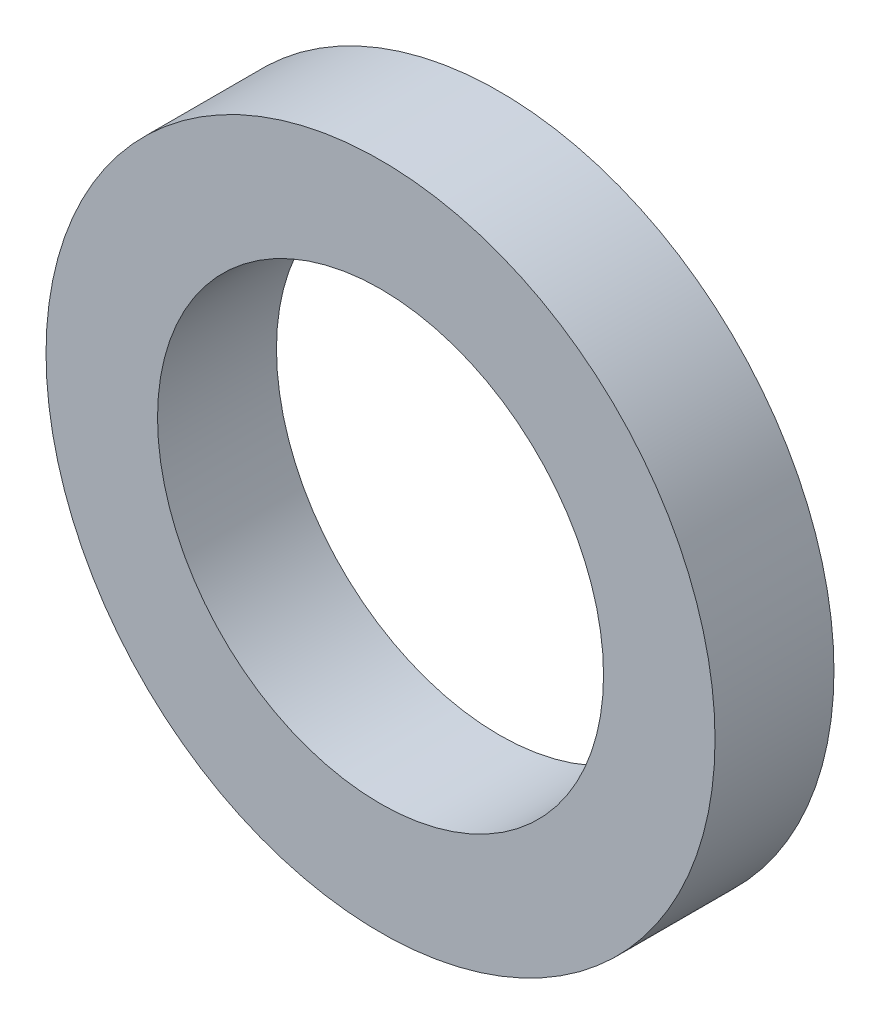
ISO-10303-21;
HEADER;
FILE_DESCRIPTION(('STEP AP214'),'2;1');
FILE_NAME('part.step','',(''),(''),'','','');
FILE_SCHEMA(('AUTOMOTIVE_DESIGN { 1 0 10303 214 1 1 1 1 }'));
ENDSEC;
DATA;
#1=APPLICATION_CONTEXT('core data for automotive mechanical design processes');
#2=APPLICATION_PROTOCOL_DEFINITION('international standard','automotive_design',2000,#1);
#3=PRODUCT_CONTEXT('',#1,'mechanical');
#4=PRODUCT('Part','Part','',(#3));
#5=PRODUCT_RELATED_PRODUCT_CATEGORY('part','',(#4));
#6=PRODUCT_DEFINITION_FORMATION('','',#4);
#7=PRODUCT_DEFINITION_CONTEXT('part definition',#1,'design');
#8=PRODUCT_DEFINITION('design','',#6,#7);
#9=PRODUCT_DEFINITION_SHAPE('','',#8);
#10=(LENGTH_UNIT() NAMED_UNIT(*) SI_UNIT(.MILLI.,.METRE.));
#11=(NAMED_UNIT(*) PLANE_ANGLE_UNIT() SI_UNIT($,.RADIAN.));
#12=(NAMED_UNIT(*) SI_UNIT($,.STERADIAN.) SOLID_ANGLE_UNIT());
#13=UNCERTAINTY_MEASURE_WITH_UNIT(LENGTH_MEASURE(1.E-05),#10,'distance_accuracy_value','');
#14=(GEOMETRIC_REPRESENTATION_CONTEXT(3) GLOBAL_UNCERTAINTY_ASSIGNED_CONTEXT((#13)) GLOBAL_UNIT_ASSIGNED_CONTEXT((#10,
#11,#12)) REPRESENTATION_CONTEXT('',''));
#15=CARTESIAN_POINT('',(0.,0.,0.));
#16=DIRECTION('',(0.,0.,1.));
#17=DIRECTION('',(1.,0.,0.));
#18=AXIS2_PLACEMENT_3D('',#15,#16,#17);
#19=CARTESIAN_POINT('',(0.,0.,8.));
#20=DIRECTION('',(0.,0.,1.));
#21=DIRECTION('',(1.,0.,0.));
#22=AXIS2_PLACEMENT_3D('',#19,#20,#21);
#23=PLANE('',#22);
#24=CARTESIAN_POINT('',(0.,0.,8.));
#25=DIRECTION('',(0.,0.,1.));
#26=DIRECTION('',(1.,0.,0.));
#27=AXIS2_PLACEMENT_3D('',#24,#25,#26);
#28=CIRCLE('',#27,22.5);
#29=CARTESIAN_POINT('',(22.5,0.,8.));
#30=VERTEX_POINT('',#29);
#31=EDGE_CURVE('E10',#30,#30,#28,.T.);
#32=ORIENTED_EDGE('',*,*,#31,.T.);
#33=EDGE_LOOP('',(#32));
#34=FACE_BOUND('',#33,.T.);
#35=CARTESIAN_POINT('',(0.,0.,8.));
#36=DIRECTION('',(0.,0.,1.));
#37=DIRECTION('',(1.,0.,0.));
#38=AXIS2_PLACEMENT_3D('',#35,#36,#37);
#39=CIRCLE('',#38,15.);
#40=CARTESIAN_POINT('',(15.,0.,8.));
#41=VERTEX_POINT('',#40);
#42=EDGE_CURVE('E50',#41,#41,#39,.T.);
#43=ORIENTED_EDGE('',*,*,#42,.F.);
#44=EDGE_LOOP('',(#43));
#45=FACE_BOUND('',#44,.T.);
#46=ADVANCED_FACE('F37',(#34,#45),#23,.T.);
#47=CARTESIAN_POINT('',(0.,0.,0.));
#48=DIRECTION('',(0.,0.,1.));
#49=DIRECTION('',(1.,0.,0.));
#50=AXIS2_PLACEMENT_3D('',#47,#48,#49);
#51=PLANE('',#50);
#52=CARTESIAN_POINT('',(0.,0.,0.));
#53=DIRECTION('',(0.,0.,1.));
#54=DIRECTION('',(1.,0.,0.));
#55=AXIS2_PLACEMENT_3D('',#52,#53,#54);
#56=CIRCLE('',#55,22.5);
#57=CARTESIAN_POINT('',(22.5,0.,0.));
#58=VERTEX_POINT('',#57);
#59=EDGE_CURVE('E41',#58,#58,#56,.T.);
#60=ORIENTED_EDGE('',*,*,#59,.F.);
#61=EDGE_LOOP('',(#60));
#62=FACE_BOUND('',#61,.T.);
#63=CARTESIAN_POINT('',(0.,0.,0.));
#64=DIRECTION('',(0.,0.,1.));
#65=DIRECTION('',(1.,0.,0.));
#66=AXIS2_PLACEMENT_3D('',#63,#64,#65);
#67=CIRCLE('',#66,15.);
#68=CARTESIAN_POINT('',(15.,0.,0.));
#69=VERTEX_POINT('',#68);
#70=EDGE_CURVE('E52',#69,#69,#67,.T.);
#71=ORIENTED_EDGE('',*,*,#70,.T.);
#72=EDGE_LOOP('',(#71));
#73=FACE_BOUND('',#72,.T.);
#74=ADVANCED_FACE('F64',(#62,#73),#51,.F.);
#75=CARTESIAN_POINT('',(0.,0.,8.));
#76=DIRECTION('',(0.,0.,-1.));
#77=DIRECTION('',(-1.,0.,0.));
#78=AXIS2_PLACEMENT_3D('',#75,#76,#77);
#79=CYLINDRICAL_SURFACE('',#78,22.5);
#80=ORIENTED_EDGE('',*,*,#31,.F.);
#81=EDGE_LOOP('',(#80));
#82=FACE_BOUND('',#81,.T.);
#83=ORIENTED_EDGE('',*,*,#59,.T.);
#84=EDGE_LOOP('',(#83));
#85=FACE_BOUND('',#84,.T.);
#86=ADVANCED_FACE('F39',(#82,#85),#79,.T.);
#87=CARTESIAN_POINT('',(0.,0.,8.));
#88=DIRECTION('',(0.,0.,-1.));
#89=DIRECTION('',(-1.,0.,0.));
#90=AXIS2_PLACEMENT_3D('',#87,#88,#89);
#91=CYLINDRICAL_SURFACE('',#90,15.);
#92=ORIENTED_EDGE('',*,*,#42,.T.);
#93=EDGE_LOOP('',(#92));
#94=FACE_BOUND('',#93,.T.);
#95=ORIENTED_EDGE('',*,*,#70,.F.);
#96=EDGE_LOOP('',(#95));
#97=FACE_BOUND('',#96,.T.);
#98=ADVANCED_FACE('F60',(#94,#97),#91,.F.);
#99=CLOSED_SHELL('',(#46,#74,#86,#98));
#100=MANIFOLD_SOLID_BREP('B2',#99);
#101=ADVANCED_BREP_SHAPE_REPRESENTATION('',(#18,#100),#14);
#102=SHAPE_DEFINITION_REPRESENTATION(#9,#101);
ENDSEC;
END-ISO-10303-21;
